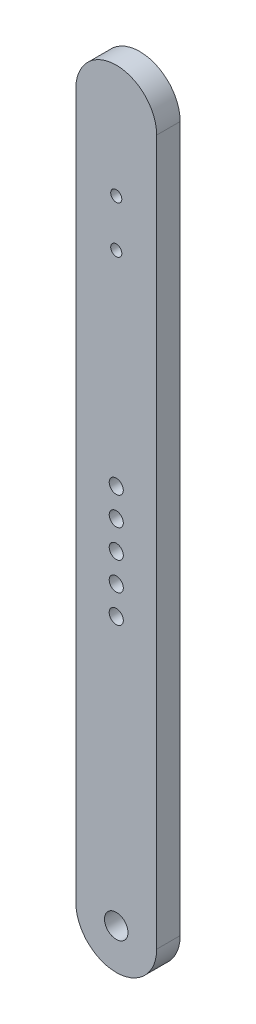
ISO-10303-21;
HEADER;
FILE_DESCRIPTION(('STEP AP214'),'2;1');
FILE_NAME('part.step','',(''),(''),'','','');
FILE_SCHEMA(('AUTOMOTIVE_DESIGN { 1 0 10303 214 1 1 1 1 }'));
ENDSEC;
DATA;
#1=APPLICATION_CONTEXT('core data for automotive mechanical design processes');
#2=APPLICATION_PROTOCOL_DEFINITION('international standard','automotive_design',2000,#1);
#3=PRODUCT_CONTEXT('',#1,'mechanical');
#4=PRODUCT('Part','Part','',(#3));
#5=PRODUCT_RELATED_PRODUCT_CATEGORY('part','',(#4));
#6=PRODUCT_DEFINITION_FORMATION('','',#4);
#7=PRODUCT_DEFINITION_CONTEXT('part definition',#1,'design');
#8=PRODUCT_DEFINITION('design','',#6,#7);
#9=PRODUCT_DEFINITION_SHAPE('','',#8);
#10=(LENGTH_UNIT() NAMED_UNIT(*) SI_UNIT(.MILLI.,.METRE.));
#11=(NAMED_UNIT(*) PLANE_ANGLE_UNIT() SI_UNIT($,.RADIAN.));
#12=(NAMED_UNIT(*) SI_UNIT($,.STERADIAN.) SOLID_ANGLE_UNIT());
#13=UNCERTAINTY_MEASURE_WITH_UNIT(LENGTH_MEASURE(1.E-05),#10,'distance_accuracy_value','');
#14=(GEOMETRIC_REPRESENTATION_CONTEXT(3) GLOBAL_UNCERTAINTY_ASSIGNED_CONTEXT((#13)) GLOBAL_UNIT_ASSIGNED_CONTEXT((#10,
#11,#12)) REPRESENTATION_CONTEXT('',''));
#15=CARTESIAN_POINT('',(0.,0.,0.));
#16=DIRECTION('',(0.,0.,1.));
#17=DIRECTION('',(1.,0.,0.));
#18=AXIS2_PLACEMENT_3D('',#15,#16,#17);
#19=CARTESIAN_POINT('',(0.,0.,6.35));
#20=DIRECTION('',(0.,0.,1.));
#21=DIRECTION('',(1.,0.,0.));
#22=AXIS2_PLACEMENT_3D('',#19,#20,#21);
#23=PLANE('',#22);
#24=CARTESIAN_POINT('',(0.,158.089184135568,6.35));
#25=DIRECTION('',(0.,0.,1.));
#26=DIRECTION('',(1.,0.,0.));
#27=AXIS2_PLACEMENT_3D('',#24,#25,#26);
#28=CIRCLE('',#27,1.49986999999999);
#29=CARTESIAN_POINT('',(1.49986999999999,158.089184135568,6.35));
#30=VERTEX_POINT('',#29);
#31=EDGE_CURVE('E151',#30,#30,#28,.T.);
#32=ORIENTED_EDGE('',*,*,#31,.F.);
#33=EDGE_LOOP('',(#32));
#34=FACE_BOUND('',#33,.T.);
#35=CARTESIAN_POINT('',(0.,72.39,6.35));
#36=DIRECTION('',(0.,0.,1.));
#37=DIRECTION('',(1.,0.,0.));
#38=AXIS2_PLACEMENT_3D('',#35,#36,#37);
#39=CIRCLE('',#38,1.90500000000001);
#40=CARTESIAN_POINT('',(1.90500000000001,72.39,6.35));
#41=VERTEX_POINT('',#40);
#42=EDGE_CURVE('E139',#41,#41,#39,.T.);
#43=ORIENTED_EDGE('',*,*,#42,.F.);
#44=EDGE_LOOP('',(#43));
#45=FACE_BOUND('',#44,.T.);
#46=CARTESIAN_POINT('',(0.,87.63,6.35));
#47=DIRECTION('',(0.,0.,1.));
#48=DIRECTION('',(1.,0.,0.));
#49=AXIS2_PLACEMENT_3D('',#46,#47,#48);
#50=CIRCLE('',#49,1.90500000000001);
#51=CARTESIAN_POINT('',(1.90500000000001,87.63,6.35));
#52=VERTEX_POINT('',#51);
#53=EDGE_CURVE('E127',#52,#52,#50,.T.);
#54=ORIENTED_EDGE('',*,*,#53,.F.);
#55=EDGE_LOOP('',(#54));
#56=FACE_BOUND('',#55,.T.);
#57=CARTESIAN_POINT('',(0.,0.,6.35));
#58=DIRECTION('',(0.,0.,1.));
#59=DIRECTION('',(1.,0.,0.));
#60=AXIS2_PLACEMENT_3D('',#57,#58,#59);
#61=CIRCLE('',#60,3.175);
#62=CARTESIAN_POINT('',(3.175,0.,6.35));
#63=VERTEX_POINT('',#62);
#64=EDGE_CURVE('E106',#63,#63,#61,.T.);
#65=ORIENTED_EDGE('',*,*,#64,.F.);
#66=EDGE_LOOP('',(#65));
#67=FACE_BOUND('',#66,.T.);
#68=CARTESIAN_POINT('',(0.,0.,6.35));
#69=DIRECTION('',(0.,0.,1.));
#70=DIRECTION('',(1.,0.,0.));
#71=AXIS2_PLACEMENT_3D('',#68,#69,#70);
#72=CIRCLE('',#71,10.922);
#73=CARTESIAN_POINT('',(-10.922,0.,6.35));
#74=VERTEX_POINT('',#73);
#75=CARTESIAN_POINT('',(10.922,0.,6.35));
#76=VERTEX_POINT('',#75);
#77=EDGE_CURVE('E91',#74,#76,#72,.T.);
#78=ORIENTED_EDGE('',*,*,#77,.T.);
#79=DIRECTION('',(0.,1.,0.));
#80=VECTOR('',#79,1.);
#81=CARTESIAN_POINT('',(10.922,0.,6.35));
#82=LINE('',#81,#80);
#83=CARTESIAN_POINT('',(10.922,190.5,6.35));
#84=VERTEX_POINT('',#83);
#85=EDGE_CURVE('E86',#76,#84,#82,.T.);
#86=ORIENTED_EDGE('',*,*,#85,.T.);
#87=CARTESIAN_POINT('',(0.,190.5,6.35));
#88=DIRECTION('',(0.,0.,1.));
#89=DIRECTION('',(1.,0.,0.));
#90=AXIS2_PLACEMENT_3D('',#87,#88,#89);
#91=CIRCLE('',#90,10.922);
#92=CARTESIAN_POINT('',(-10.922,190.5,6.35));
#93=VERTEX_POINT('',#92);
#94=EDGE_CURVE('E89',#84,#93,#91,.T.);
#95=ORIENTED_EDGE('',*,*,#94,.T.);
#96=DIRECTION('',(0.,-1.,0.));
#97=VECTOR('',#96,1.);
#98=CARTESIAN_POINT('',(-10.922,0.,6.35));
#99=LINE('',#98,#97);
#100=EDGE_CURVE('E56',#93,#74,#99,.T.);
#101=ORIENTED_EDGE('',*,*,#100,.T.);
#102=EDGE_LOOP('',(#78,#86,#95,#101));
#103=FACE_BOUND('',#102,.T.);
#104=CARTESIAN_POINT('',(0.,95.25,6.35));
#105=DIRECTION('',(0.,0.,1.));
#106=DIRECTION('',(1.,0.,0.));
#107=AXIS2_PLACEMENT_3D('',#104,#105,#106);
#108=CIRCLE('',#107,1.90500000000001);
#109=CARTESIAN_POINT('',(1.90500000000001,95.25,6.35));
#110=VERTEX_POINT('',#109);
#111=EDGE_CURVE('E121',#110,#110,#108,.T.);
#112=ORIENTED_EDGE('',*,*,#111,.F.);
#113=EDGE_LOOP('',(#112));
#114=FACE_BOUND('',#113,.T.);
#115=CARTESIAN_POINT('',(0.,80.01,6.35));
#116=DIRECTION('',(0.,0.,1.));
#117=DIRECTION('',(1.,0.,0.));
#118=AXIS2_PLACEMENT_3D('',#115,#116,#117);
#119=CIRCLE('',#118,1.90500000000001);
#120=CARTESIAN_POINT('',(1.90500000000001,80.01,6.35));
#121=VERTEX_POINT('',#120);
#122=EDGE_CURVE('E133',#121,#121,#119,.T.);
#123=ORIENTED_EDGE('',*,*,#122,.F.);
#124=EDGE_LOOP('',(#123));
#125=FACE_BOUND('',#124,.T.);
#126=CARTESIAN_POINT('',(0.,170.789184135568,6.35));
#127=DIRECTION('',(0.,0.,1.));
#128=DIRECTION('',(1.,0.,0.));
#129=AXIS2_PLACEMENT_3D('',#126,#127,#128);
#130=CIRCLE('',#129,1.49986999999999);
#131=CARTESIAN_POINT('',(1.49986999999999,170.789184135568,6.35));
#132=VERTEX_POINT('',#131);
#133=EDGE_CURVE('E145',#132,#132,#130,.T.);
#134=ORIENTED_EDGE('',*,*,#133,.F.);
#135=EDGE_LOOP('',(#134));
#136=FACE_BOUND('',#135,.T.);
#137=CARTESIAN_POINT('',(0.,102.87,6.35));
#138=DIRECTION('',(0.,0.,1.));
#139=DIRECTION('',(1.,0.,0.));
#140=AXIS2_PLACEMENT_3D('',#137,#138,#139);
#141=CIRCLE('',#140,1.90500000000001);
#142=CARTESIAN_POINT('',(1.90500000000001,102.87,6.35));
#143=VERTEX_POINT('',#142);
#144=EDGE_CURVE('E157',#143,#143,#141,.T.);
#145=ORIENTED_EDGE('',*,*,#144,.F.);
#146=EDGE_LOOP('',(#145));
#147=FACE_BOUND('',#146,.T.);
#148=ADVANCED_FACE('F39',(#34,#45,#56,#67,#103,#114,#125,#136,#147),#23,.T.);
#149=CARTESIAN_POINT('',(0.,0.,0.));
#150=DIRECTION('',(0.,0.,1.));
#151=DIRECTION('',(1.,0.,0.));
#152=AXIS2_PLACEMENT_3D('',#149,#150,#151);
#153=PLANE('',#152);
#154=CARTESIAN_POINT('',(0.,0.,0.));
#155=DIRECTION('',(0.,0.,1.));
#156=DIRECTION('',(1.,0.,0.));
#157=AXIS2_PLACEMENT_3D('',#154,#155,#156);
#158=CIRCLE('',#157,10.922);
#159=CARTESIAN_POINT('',(-10.922,0.,0.));
#160=VERTEX_POINT('',#159);
#161=CARTESIAN_POINT('',(10.922,0.,0.));
#162=VERTEX_POINT('',#161);
#163=EDGE_CURVE('E103',#160,#162,#158,.T.);
#164=ORIENTED_EDGE('',*,*,#163,.F.);
#165=DIRECTION('',(0.,-1.,0.));
#166=VECTOR('',#165,1.);
#167=CARTESIAN_POINT('',(-10.922,0.,0.));
#168=LINE('',#167,#166);
#169=CARTESIAN_POINT('',(-10.922,190.5,0.));
#170=VERTEX_POINT('',#169);
#171=EDGE_CURVE('E79',#170,#160,#168,.T.);
#172=ORIENTED_EDGE('',*,*,#171,.F.);
#173=CARTESIAN_POINT('',(0.,190.5,0.));
#174=DIRECTION('',(0.,0.,1.));
#175=DIRECTION('',(1.,0.,0.));
#176=AXIS2_PLACEMENT_3D('',#173,#174,#175);
#177=CIRCLE('',#176,10.922);
#178=CARTESIAN_POINT('',(10.922,190.5,0.));
#179=VERTEX_POINT('',#178);
#180=EDGE_CURVE('E73',#179,#170,#177,.T.);
#181=ORIENTED_EDGE('',*,*,#180,.F.);
#182=DIRECTION('',(0.,1.,0.));
#183=VECTOR('',#182,1.);
#184=CARTESIAN_POINT('',(10.922,0.,0.));
#185=LINE('',#184,#183);
#186=EDGE_CURVE('E95',#162,#179,#185,.T.);
#187=ORIENTED_EDGE('',*,*,#186,.F.);
#188=EDGE_LOOP('',(#164,#172,#181,#187));
#189=FACE_BOUND('',#188,.T.);
#190=CARTESIAN_POINT('',(0.,0.,0.));
#191=DIRECTION('',(0.,0.,1.));
#192=DIRECTION('',(1.,0.,0.));
#193=AXIS2_PLACEMENT_3D('',#190,#191,#192);
#194=CIRCLE('',#193,3.175);
#195=CARTESIAN_POINT('',(3.175,0.,0.));
#196=VERTEX_POINT('',#195);
#197=EDGE_CURVE('E118',#196,#196,#194,.T.);
#198=ORIENTED_EDGE('',*,*,#197,.T.);
#199=EDGE_LOOP('',(#198));
#200=FACE_BOUND('',#199,.T.);
#201=CARTESIAN_POINT('',(0.,95.25,0.));
#202=DIRECTION('',(0.,0.,1.));
#203=DIRECTION('',(1.,0.,0.));
#204=AXIS2_PLACEMENT_3D('',#201,#202,#203);
#205=CIRCLE('',#204,1.90500000000001);
#206=CARTESIAN_POINT('',(1.90500000000001,95.25,0.));
#207=VERTEX_POINT('',#206);
#208=EDGE_CURVE('E124',#207,#207,#205,.T.);
#209=ORIENTED_EDGE('',*,*,#208,.T.);
#210=EDGE_LOOP('',(#209));
#211=FACE_BOUND('',#210,.T.);
#212=CARTESIAN_POINT('',(0.,87.63,0.));
#213=DIRECTION('',(0.,0.,1.));
#214=DIRECTION('',(1.,0.,0.));
#215=AXIS2_PLACEMENT_3D('',#212,#213,#214);
#216=CIRCLE('',#215,1.90500000000001);
#217=CARTESIAN_POINT('',(1.90500000000001,87.63,0.));
#218=VERTEX_POINT('',#217);
#219=EDGE_CURVE('E130',#218,#218,#216,.T.);
#220=ORIENTED_EDGE('',*,*,#219,.T.);
#221=EDGE_LOOP('',(#220));
#222=FACE_BOUND('',#221,.T.);
#223=CARTESIAN_POINT('',(0.,80.01,0.));
#224=DIRECTION('',(0.,0.,1.));
#225=DIRECTION('',(1.,0.,0.));
#226=AXIS2_PLACEMENT_3D('',#223,#224,#225);
#227=CIRCLE('',#226,1.90500000000001);
#228=CARTESIAN_POINT('',(1.90500000000001,80.01,0.));
#229=VERTEX_POINT('',#228);
#230=EDGE_CURVE('E136',#229,#229,#227,.T.);
#231=ORIENTED_EDGE('',*,*,#230,.T.);
#232=EDGE_LOOP('',(#231));
#233=FACE_BOUND('',#232,.T.);
#234=CARTESIAN_POINT('',(0.,72.39,0.));
#235=DIRECTION('',(0.,0.,1.));
#236=DIRECTION('',(1.,0.,0.));
#237=AXIS2_PLACEMENT_3D('',#234,#235,#236);
#238=CIRCLE('',#237,1.90500000000001);
#239=CARTESIAN_POINT('',(1.90500000000001,72.39,0.));
#240=VERTEX_POINT('',#239);
#241=EDGE_CURVE('E142',#240,#240,#238,.T.);
#242=ORIENTED_EDGE('',*,*,#241,.T.);
#243=EDGE_LOOP('',(#242));
#244=FACE_BOUND('',#243,.T.);
#245=CARTESIAN_POINT('',(0.,170.789184135568,0.));
#246=DIRECTION('',(0.,0.,1.));
#247=DIRECTION('',(1.,0.,0.));
#248=AXIS2_PLACEMENT_3D('',#245,#246,#247);
#249=CIRCLE('',#248,1.49986999999999);
#250=CARTESIAN_POINT('',(1.49986999999999,170.789184135568,0.));
#251=VERTEX_POINT('',#250);
#252=EDGE_CURVE('E148',#251,#251,#249,.T.);
#253=ORIENTED_EDGE('',*,*,#252,.T.);
#254=EDGE_LOOP('',(#253));
#255=FACE_BOUND('',#254,.T.);
#256=CARTESIAN_POINT('',(0.,158.089184135568,0.));
#257=DIRECTION('',(0.,0.,1.));
#258=DIRECTION('',(1.,0.,0.));
#259=AXIS2_PLACEMENT_3D('',#256,#257,#258);
#260=CIRCLE('',#259,1.49986999999999);
#261=CARTESIAN_POINT('',(1.49986999999999,158.089184135568,0.));
#262=VERTEX_POINT('',#261);
#263=EDGE_CURVE('E154',#262,#262,#260,.T.);
#264=ORIENTED_EDGE('',*,*,#263,.T.);
#265=EDGE_LOOP('',(#264));
#266=FACE_BOUND('',#265,.T.);
#267=CARTESIAN_POINT('',(0.,102.87,0.));
#268=DIRECTION('',(0.,0.,1.));
#269=DIRECTION('',(1.,0.,0.));
#270=AXIS2_PLACEMENT_3D('',#267,#268,#269);
#271=CIRCLE('',#270,1.90500000000001);
#272=CARTESIAN_POINT('',(1.90500000000001,102.87,0.));
#273=VERTEX_POINT('',#272);
#274=EDGE_CURVE('E160',#273,#273,#271,.T.);
#275=ORIENTED_EDGE('',*,*,#274,.T.);
#276=EDGE_LOOP('',(#275));
#277=FACE_BOUND('',#276,.T.);
#278=ADVANCED_FACE('F114',(#189,#200,#211,#222,#233,#244,#255,#266,#277),#153,.F.);
#279=CARTESIAN_POINT('',(0.,0.,6.35));
#280=DIRECTION('',(0.,0.,-1.));
#281=DIRECTION('',(-1.,0.,0.));
#282=AXIS2_PLACEMENT_3D('',#279,#280,#281);
#283=CYLINDRICAL_SURFACE('',#282,10.922);
#284=ORIENTED_EDGE('',*,*,#163,.T.);
#285=DIRECTION('',(0.,0.,-1.));
#286=VECTOR('',#285,1.);
#287=CARTESIAN_POINT('',(10.922,0.,6.35));
#288=LINE('',#287,#286);
#289=EDGE_CURVE('E11',#76,#162,#288,.T.);
#290=ORIENTED_EDGE('',*,*,#289,.F.);
#291=ORIENTED_EDGE('',*,*,#77,.F.);
#292=DIRECTION('',(0.,0.,-1.));
#293=VECTOR('',#292,1.);
#294=CARTESIAN_POINT('',(-10.922,0.,6.35));
#295=LINE('',#294,#293);
#296=EDGE_CURVE('E99',#74,#160,#295,.T.);
#297=ORIENTED_EDGE('',*,*,#296,.T.);
#298=EDGE_LOOP('',(#284,#290,#291,#297));
#299=FACE_BOUND('',#298,.T.);
#300=ADVANCED_FACE('F41',(#299),#283,.T.);
#301=CARTESIAN_POINT('',(10.922,0.,6.35));
#302=DIRECTION('',(-1.,0.,0.));
#303=DIRECTION('',(0.,0.,1.));
#304=AXIS2_PLACEMENT_3D('',#301,#302,#303);
#305=PLANE('',#304);
#306=ORIENTED_EDGE('',*,*,#186,.T.);
#307=DIRECTION('',(0.,0.,-1.));
#308=VECTOR('',#307,1.);
#309=CARTESIAN_POINT('',(10.922,190.5,6.35));
#310=LINE('',#309,#308);
#311=EDGE_CURVE('E48',#84,#179,#310,.T.);
#312=ORIENTED_EDGE('',*,*,#311,.F.);
#313=ORIENTED_EDGE('',*,*,#85,.F.);
#314=ORIENTED_EDGE('',*,*,#289,.T.);
#315=EDGE_LOOP('',(#306,#312,#313,#314));
#316=FACE_BOUND('',#315,.T.);
#317=ADVANCED_FACE('F94',(#316),#305,.F.);
#318=CARTESIAN_POINT('',(0.,190.5,6.35));
#319=DIRECTION('',(0.,0.,-1.));
#320=DIRECTION('',(-1.,0.,0.));
#321=AXIS2_PLACEMENT_3D('',#318,#319,#320);
#322=CYLINDRICAL_SURFACE('',#321,10.922);
#323=ORIENTED_EDGE('',*,*,#180,.T.);
#324=DIRECTION('',(0.,0.,-1.));
#325=VECTOR('',#324,1.);
#326=CARTESIAN_POINT('',(-10.922,190.5,6.35));
#327=LINE('',#326,#325);
#328=EDGE_CURVE('E96',#93,#170,#327,.T.);
#329=ORIENTED_EDGE('',*,*,#328,.F.);
#330=ORIENTED_EDGE('',*,*,#94,.F.);
#331=ORIENTED_EDGE('',*,*,#311,.T.);
#332=EDGE_LOOP('',(#323,#329,#330,#331));
#333=FACE_BOUND('',#332,.T.);
#334=ADVANCED_FACE('F97',(#333),#322,.T.);
#335=CARTESIAN_POINT('',(-10.922,0.,6.35));
#336=DIRECTION('',(1.,0.,0.));
#337=DIRECTION('',(0.,1.,0.));
#338=AXIS2_PLACEMENT_3D('',#335,#336,#337);
#339=PLANE('',#338);
#340=ORIENTED_EDGE('',*,*,#171,.T.);
#341=ORIENTED_EDGE('',*,*,#296,.F.);
#342=ORIENTED_EDGE('',*,*,#100,.F.);
#343=ORIENTED_EDGE('',*,*,#328,.T.);
#344=EDGE_LOOP('',(#340,#341,#342,#343));
#345=FACE_BOUND('',#344,.T.);
#346=ADVANCED_FACE('F111',(#345),#339,.F.);
#347=CARTESIAN_POINT('',(0.,0.,6.35));
#348=DIRECTION('',(0.,0.,-1.));
#349=DIRECTION('',(-1.,0.,0.));
#350=AXIS2_PLACEMENT_3D('',#347,#348,#349);
#351=CYLINDRICAL_SURFACE('',#350,3.175);
#352=ORIENTED_EDGE('',*,*,#64,.T.);
#353=EDGE_LOOP('',(#352));
#354=FACE_BOUND('',#353,.T.);
#355=ORIENTED_EDGE('',*,*,#197,.F.);
#356=EDGE_LOOP('',(#355));
#357=FACE_BOUND('',#356,.T.);
#358=ADVANCED_FACE('F179',(#354,#357),#351,.F.);
#359=CARTESIAN_POINT('',(0.,95.25,6.35));
#360=DIRECTION('',(0.,0.,-1.));
#361=DIRECTION('',(-1.,0.,0.));
#362=AXIS2_PLACEMENT_3D('',#359,#360,#361);
#363=CYLINDRICAL_SURFACE('',#362,1.90500000000001);
#364=ORIENTED_EDGE('',*,*,#111,.T.);
#365=EDGE_LOOP('',(#364));
#366=FACE_BOUND('',#365,.T.);
#367=ORIENTED_EDGE('',*,*,#208,.F.);
#368=EDGE_LOOP('',(#367));
#369=FACE_BOUND('',#368,.T.);
#370=ADVANCED_FACE('F247',(#366,#369),#363,.F.);
#371=CARTESIAN_POINT('',(0.,87.63,6.35));
#372=DIRECTION('',(0.,0.,-1.));
#373=DIRECTION('',(-1.,0.,0.));
#374=AXIS2_PLACEMENT_3D('',#371,#372,#373);
#375=CYLINDRICAL_SURFACE('',#374,1.90500000000001);
#376=ORIENTED_EDGE('',*,*,#53,.T.);
#377=EDGE_LOOP('',(#376));
#378=FACE_BOUND('',#377,.T.);
#379=ORIENTED_EDGE('',*,*,#219,.F.);
#380=EDGE_LOOP('',(#379));
#381=FACE_BOUND('',#380,.T.);
#382=ADVANCED_FACE('F258',(#378,#381),#375,.F.);
#383=CARTESIAN_POINT('',(0.,80.01,6.35));
#384=DIRECTION('',(0.,0.,-1.));
#385=DIRECTION('',(-1.,0.,0.));
#386=AXIS2_PLACEMENT_3D('',#383,#384,#385);
#387=CYLINDRICAL_SURFACE('',#386,1.90500000000001);
#388=ORIENTED_EDGE('',*,*,#122,.T.);
#389=EDGE_LOOP('',(#388));
#390=FACE_BOUND('',#389,.T.);
#391=ORIENTED_EDGE('',*,*,#230,.F.);
#392=EDGE_LOOP('',(#391));
#393=FACE_BOUND('',#392,.T.);
#394=ADVANCED_FACE('F269',(#390,#393),#387,.F.);
#395=CARTESIAN_POINT('',(0.,72.39,6.35));
#396=DIRECTION('',(0.,0.,-1.));
#397=DIRECTION('',(-1.,0.,0.));
#398=AXIS2_PLACEMENT_3D('',#395,#396,#397);
#399=CYLINDRICAL_SURFACE('',#398,1.90500000000001);
#400=ORIENTED_EDGE('',*,*,#42,.T.);
#401=EDGE_LOOP('',(#400));
#402=FACE_BOUND('',#401,.T.);
#403=ORIENTED_EDGE('',*,*,#241,.F.);
#404=EDGE_LOOP('',(#403));
#405=FACE_BOUND('',#404,.T.);
#406=ADVANCED_FACE('F281',(#402,#405),#399,.F.);
#407=CARTESIAN_POINT('',(0.,170.789184135568,6.35));
#408=DIRECTION('',(0.,0.,-1.));
#409=DIRECTION('',(-1.,0.,0.));
#410=AXIS2_PLACEMENT_3D('',#407,#408,#409);
#411=CYLINDRICAL_SURFACE('',#410,1.49986999999999);
#412=ORIENTED_EDGE('',*,*,#133,.T.);
#413=EDGE_LOOP('',(#412));
#414=FACE_BOUND('',#413,.T.);
#415=ORIENTED_EDGE('',*,*,#252,.F.);
#416=EDGE_LOOP('',(#415));
#417=FACE_BOUND('',#416,.T.);
#418=ADVANCED_FACE('F293',(#414,#417),#411,.F.);
#419=CARTESIAN_POINT('',(0.,158.089184135568,6.35));
#420=DIRECTION('',(0.,0.,-1.));
#421=DIRECTION('',(-1.,0.,0.));
#422=AXIS2_PLACEMENT_3D('',#419,#420,#421);
#423=CYLINDRICAL_SURFACE('',#422,1.49986999999999);
#424=ORIENTED_EDGE('',*,*,#31,.T.);
#425=EDGE_LOOP('',(#424));
#426=FACE_BOUND('',#425,.T.);
#427=ORIENTED_EDGE('',*,*,#263,.F.);
#428=EDGE_LOOP('',(#427));
#429=FACE_BOUND('',#428,.T.);
#430=ADVANCED_FACE('F305',(#426,#429),#423,.F.);
#431=CARTESIAN_POINT('',(0.,102.87,6.35));
#432=DIRECTION('',(0.,0.,-1.));
#433=DIRECTION('',(-1.,0.,0.));
#434=AXIS2_PLACEMENT_3D('',#431,#432,#433);
#435=CYLINDRICAL_SURFACE('',#434,1.90500000000001);
#436=ORIENTED_EDGE('',*,*,#144,.T.);
#437=EDGE_LOOP('',(#436));
#438=FACE_BOUND('',#437,.T.);
#439=ORIENTED_EDGE('',*,*,#274,.F.);
#440=EDGE_LOOP('',(#439));
#441=FACE_BOUND('',#440,.T.);
#442=ADVANCED_FACE('F166',(#438,#441),#435,.F.);
#443=CLOSED_SHELL('',(#148,#278,#300,#317,#334,#346,#358,#370,#382,#394,#406,#418,#430,#442));
#444=MANIFOLD_SOLID_BREP('B2',#443);
#445=ADVANCED_BREP_SHAPE_REPRESENTATION('',(#18,#444),#14);
#446=SHAPE_DEFINITION_REPRESENTATION(#9,#445);
ENDSEC;
END-ISO-10303-21;
